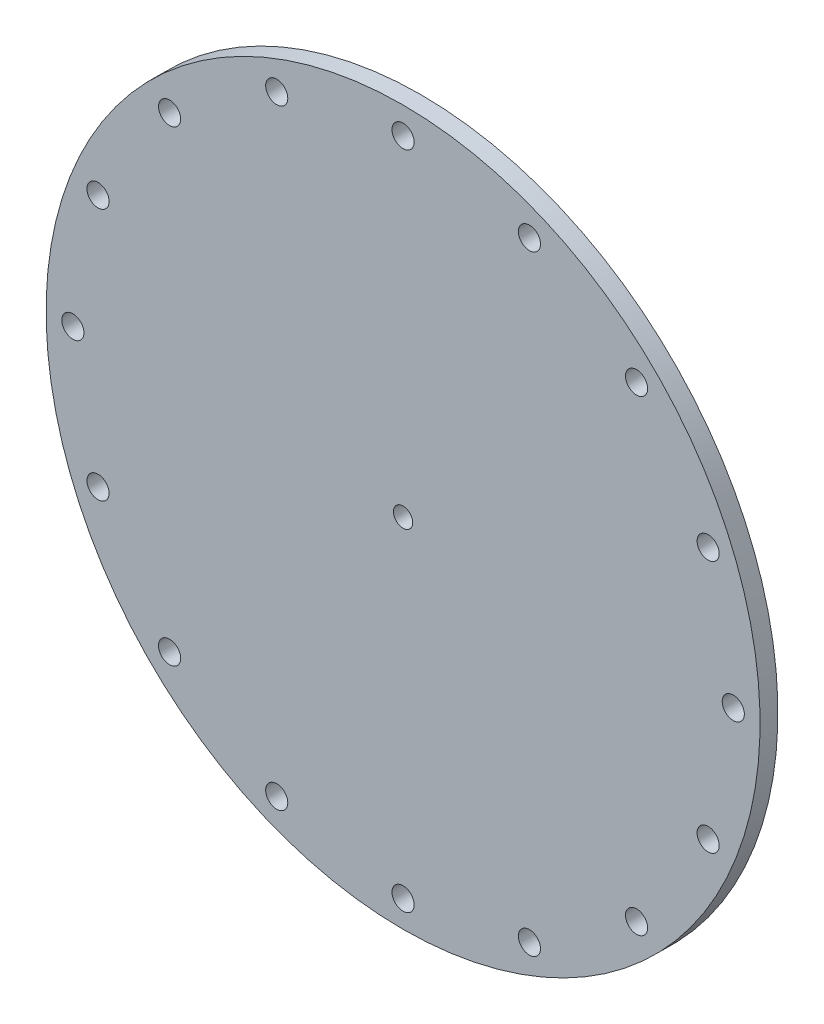
ISO-10303-21;
HEADER;
FILE_DESCRIPTION(('STEP AP214'),'2;1');
FILE_NAME('part.step','',(''),(''),'','','');
FILE_SCHEMA(('AUTOMOTIVE_DESIGN { 1 0 10303 214 1 1 1 1 }'));
ENDSEC;
DATA;
#1=APPLICATION_CONTEXT('core data for automotive mechanical design processes');
#2=APPLICATION_PROTOCOL_DEFINITION('international standard','automotive_design',2000,#1);
#3=PRODUCT_CONTEXT('',#1,'mechanical');
#4=PRODUCT('Part','Part','',(#3));
#5=PRODUCT_RELATED_PRODUCT_CATEGORY('part','',(#4));
#6=PRODUCT_DEFINITION_FORMATION('','',#4);
#7=PRODUCT_DEFINITION_CONTEXT('part definition',#1,'design');
#8=PRODUCT_DEFINITION('design','',#6,#7);
#9=PRODUCT_DEFINITION_SHAPE('','',#8);
#10=(LENGTH_UNIT() NAMED_UNIT(*) SI_UNIT(.MILLI.,.METRE.));
#11=(NAMED_UNIT(*) PLANE_ANGLE_UNIT() SI_UNIT($,.RADIAN.));
#12=(NAMED_UNIT(*) SI_UNIT($,.STERADIAN.) SOLID_ANGLE_UNIT());
#13=UNCERTAINTY_MEASURE_WITH_UNIT(LENGTH_MEASURE(1.E-05),#10,'distance_accuracy_value','');
#14=(GEOMETRIC_REPRESENTATION_CONTEXT(3) GLOBAL_UNCERTAINTY_ASSIGNED_CONTEXT((#13)) GLOBAL_UNIT_ASSIGNED_CONTEXT((#10,
#11,#12)) REPRESENTATION_CONTEXT('',''));
#15=CARTESIAN_POINT('',(0.,0.,0.));
#16=DIRECTION('',(0.,0.,1.));
#17=DIRECTION('',(1.,0.,0.));
#18=AXIS2_PLACEMENT_3D('',#15,#16,#17);
#19=CARTESIAN_POINT('',(-44.955736217089,108.532748081763,-359.266367059317));
#20=DIRECTION('',(0.,0.,1.));
#21=DIRECTION('',(1.,0.,0.));
#22=AXIS2_PLACEMENT_3D('',#19,#20,#21);
#23=CYLINDRICAL_SURFACE('',#22,3.937);
#24=CARTESIAN_POINT('',(-44.955736217089,108.532748081763,-6.34999999999998));
#25=DIRECTION('',(0.,0.,1.));
#26=DIRECTION('',(1.,0.,0.));
#27=AXIS2_PLACEMENT_3D('',#24,#25,#26);
#28=CIRCLE('',#27,3.937);
#29=CARTESIAN_POINT('',(-41.018736217089,108.532748081763,-6.34999999999998));
#30=VERTEX_POINT('',#29);
#31=EDGE_CURVE('E25',#30,#30,#28,.T.);
#32=ORIENTED_EDGE('',*,*,#31,.F.);
#33=EDGE_LOOP('',(#32));
#34=FACE_BOUND('',#33,.T.);
#35=CARTESIAN_POINT('',(-44.955736217089,108.532748081763,0.));
#36=DIRECTION('',(0.,0.,-1.));
#37=DIRECTION('',(0.,-1.,0.));
#38=AXIS2_PLACEMENT_3D('',#35,#36,#37);
#39=CIRCLE('',#38,3.937);
#40=CARTESIAN_POINT('',(-44.955736217089,104.595748081763,0.));
#41=VERTEX_POINT('',#40);
#42=EDGE_CURVE('E40',#41,#41,#39,.T.);
#43=ORIENTED_EDGE('',*,*,#42,.F.);
#44=EDGE_LOOP('',(#43));
#45=FACE_BOUND('',#44,.T.);
#46=ADVANCED_FACE('F14',(#34,#45),#23,.F.);
#47=CARTESIAN_POINT('',(-83.0673691198898,83.0673691198896,-359.266367059317));
#48=DIRECTION('',(0.,0.,1.));
#49=DIRECTION('',(1.,0.,0.));
#50=AXIS2_PLACEMENT_3D('',#47,#48,#49);
#51=CYLINDRICAL_SURFACE('',#50,3.937);
#52=CARTESIAN_POINT('',(-83.0673691198898,83.0673691198896,-6.34999999999998));
#53=DIRECTION('',(0.,0.,1.));
#54=DIRECTION('',(1.,0.,0.));
#55=AXIS2_PLACEMENT_3D('',#52,#53,#54);
#56=CIRCLE('',#55,3.937);
#57=CARTESIAN_POINT('',(-79.1303691198898,83.0673691198896,-6.34999999999998));
#58=VERTEX_POINT('',#57);
#59=EDGE_CURVE('E29',#58,#58,#56,.T.);
#60=ORIENTED_EDGE('',*,*,#59,.F.);
#61=EDGE_LOOP('',(#60));
#62=FACE_BOUND('',#61,.T.);
#63=CARTESIAN_POINT('',(-83.0673691198898,83.0673691198896,0.));
#64=DIRECTION('',(0.,0.,-1.));
#65=DIRECTION('',(0.,-1.,0.));
#66=AXIS2_PLACEMENT_3D('',#63,#64,#65);
#67=CIRCLE('',#66,3.937);
#68=CARTESIAN_POINT('',(-83.0673691198898,79.1303691198896,0.));
#69=VERTEX_POINT('',#68);
#70=EDGE_CURVE('E121',#69,#69,#67,.T.);
#71=ORIENTED_EDGE('',*,*,#70,.F.);
#72=EDGE_LOOP('',(#71));
#73=FACE_BOUND('',#72,.T.);
#74=ADVANCED_FACE('F135',(#62,#73),#51,.F.);
#75=CARTESIAN_POINT('',(-108.532748081763,44.9557362170889,-359.266367059317));
#76=DIRECTION('',(0.,0.,1.));
#77=DIRECTION('',(1.,0.,0.));
#78=AXIS2_PLACEMENT_3D('',#75,#76,#77);
#79=CYLINDRICAL_SURFACE('',#78,3.937);
#80=CARTESIAN_POINT('',(-108.532748081763,44.9557362170889,-6.34999999999998));
#81=DIRECTION('',(0.,0.,1.));
#82=DIRECTION('',(1.,0.,0.));
#83=AXIS2_PLACEMENT_3D('',#80,#81,#82);
#84=CIRCLE('',#83,3.937);
#85=CARTESIAN_POINT('',(-104.595748081763,44.9557362170889,-6.34999999999998));
#86=VERTEX_POINT('',#85);
#87=EDGE_CURVE('E118',#86,#86,#84,.T.);
#88=ORIENTED_EDGE('',*,*,#87,.F.);
#89=EDGE_LOOP('',(#88));
#90=FACE_BOUND('',#89,.T.);
#91=CARTESIAN_POINT('',(-108.532748081763,44.9557362170889,0.));
#92=DIRECTION('',(0.,0.,-1.));
#93=DIRECTION('',(0.,-1.,0.));
#94=AXIS2_PLACEMENT_3D('',#91,#92,#93);
#95=CIRCLE('',#94,3.937);
#96=CARTESIAN_POINT('',(-108.532748081763,41.0187362170889,0.));
#97=VERTEX_POINT('',#96);
#98=EDGE_CURVE('E115',#97,#97,#95,.T.);
#99=ORIENTED_EDGE('',*,*,#98,.F.);
#100=EDGE_LOOP('',(#99));
#101=FACE_BOUND('',#100,.T.);
#102=ADVANCED_FACE('F142',(#90,#101),#79,.F.);
#103=CARTESIAN_POINT('',(-117.475,-1.332267592E-13,-359.266367059317));
#104=DIRECTION('',(0.,0.,1.));
#105=DIRECTION('',(1.,0.,0.));
#106=AXIS2_PLACEMENT_3D('',#103,#104,#105);
#107=CYLINDRICAL_SURFACE('',#106,3.937);
#108=CARTESIAN_POINT('',(-117.475,-1.332267592E-13,-6.34999999999998));
#109=DIRECTION('',(0.,0.,1.));
#110=DIRECTION('',(1.,0.,0.));
#111=AXIS2_PLACEMENT_3D('',#108,#109,#110);
#112=CIRCLE('',#111,3.937);
#113=CARTESIAN_POINT('',(-113.538,-1.332267592E-13,-6.34999999999998));
#114=VERTEX_POINT('',#113);
#115=EDGE_CURVE('E112',#114,#114,#112,.T.);
#116=ORIENTED_EDGE('',*,*,#115,.F.);
#117=EDGE_LOOP('',(#116));
#118=FACE_BOUND('',#117,.T.);
#119=CARTESIAN_POINT('',(-117.475,-1.332267592E-13,0.));
#120=DIRECTION('',(0.,0.,-1.));
#121=DIRECTION('',(0.,-1.,0.));
#122=AXIS2_PLACEMENT_3D('',#119,#120,#121);
#123=CIRCLE('',#122,3.937);
#124=CARTESIAN_POINT('',(-117.475,-3.93700000000013,0.));
#125=VERTEX_POINT('',#124);
#126=EDGE_CURVE('E109',#125,#125,#123,.T.);
#127=ORIENTED_EDGE('',*,*,#126,.F.);
#128=EDGE_LOOP('',(#127));
#129=FACE_BOUND('',#128,.T.);
#130=ADVANCED_FACE('F150',(#118,#129),#107,.F.);
#131=CARTESIAN_POINT('',(-108.532748081763,-44.955736217089,-359.266367059317));
#132=DIRECTION('',(0.,0.,1.));
#133=DIRECTION('',(1.,0.,0.));
#134=AXIS2_PLACEMENT_3D('',#131,#132,#133);
#135=CYLINDRICAL_SURFACE('',#134,3.937);
#136=CARTESIAN_POINT('',(-108.532748081763,-44.955736217089,-6.34999999999998));
#137=DIRECTION('',(0.,0.,1.));
#138=DIRECTION('',(1.,0.,0.));
#139=AXIS2_PLACEMENT_3D('',#136,#137,#138);
#140=CIRCLE('',#139,3.937);
#141=CARTESIAN_POINT('',(-104.595748081763,-44.955736217089,-6.34999999999998));
#142=VERTEX_POINT('',#141);
#143=EDGE_CURVE('E106',#142,#142,#140,.T.);
#144=ORIENTED_EDGE('',*,*,#143,.F.);
#145=EDGE_LOOP('',(#144));
#146=FACE_BOUND('',#145,.T.);
#147=CARTESIAN_POINT('',(-108.532748081763,-44.955736217089,0.));
#148=DIRECTION('',(0.,0.,-1.));
#149=DIRECTION('',(0.,-1.,0.));
#150=AXIS2_PLACEMENT_3D('',#147,#148,#149);
#151=CIRCLE('',#150,3.937);
#152=CARTESIAN_POINT('',(-108.532748081763,-48.892736217089,0.));
#153=VERTEX_POINT('',#152);
#154=EDGE_CURVE('E103',#153,#153,#151,.T.);
#155=ORIENTED_EDGE('',*,*,#154,.F.);
#156=EDGE_LOOP('',(#155));
#157=FACE_BOUND('',#156,.T.);
#158=ADVANCED_FACE('F154',(#146,#157),#135,.F.);
#159=CARTESIAN_POINT('',(-83.0673691198896,-83.0673691198897,-359.266367059317));
#160=DIRECTION('',(0.,0.,1.));
#161=DIRECTION('',(1.,0.,0.));
#162=AXIS2_PLACEMENT_3D('',#159,#160,#161);
#163=CYLINDRICAL_SURFACE('',#162,3.937);
#164=CARTESIAN_POINT('',(-83.0673691198896,-83.0673691198897,-6.34999999999998));
#165=DIRECTION('',(0.,0.,1.));
#166=DIRECTION('',(1.,0.,0.));
#167=AXIS2_PLACEMENT_3D('',#164,#165,#166);
#168=CIRCLE('',#167,3.937);
#169=CARTESIAN_POINT('',(-79.1303691198896,-83.0673691198897,-6.34999999999998));
#170=VERTEX_POINT('',#169);
#171=EDGE_CURVE('E100',#170,#170,#168,.T.);
#172=ORIENTED_EDGE('',*,*,#171,.F.);
#173=EDGE_LOOP('',(#172));
#174=FACE_BOUND('',#173,.T.);
#175=CARTESIAN_POINT('',(-83.0673691198896,-83.0673691198897,0.));
#176=DIRECTION('',(0.,0.,-1.));
#177=DIRECTION('',(0.,-1.,0.));
#178=AXIS2_PLACEMENT_3D('',#175,#176,#177);
#179=CIRCLE('',#178,3.937);
#180=CARTESIAN_POINT('',(-83.0673691198896,-87.0043691198897,0.));
#181=VERTEX_POINT('',#180);
#182=EDGE_CURVE('E97',#181,#181,#179,.T.);
#183=ORIENTED_EDGE('',*,*,#182,.F.);
#184=EDGE_LOOP('',(#183));
#185=FACE_BOUND('',#184,.T.);
#186=ADVANCED_FACE('F158',(#174,#185),#163,.F.);
#187=CARTESIAN_POINT('',(-44.9557362170889,-108.532748081763,-359.266367059317));
#188=DIRECTION('',(0.,0.,1.));
#189=DIRECTION('',(1.,0.,0.));
#190=AXIS2_PLACEMENT_3D('',#187,#188,#189);
#191=CYLINDRICAL_SURFACE('',#190,3.937);
#192=CARTESIAN_POINT('',(-44.9557362170889,-108.532748081763,-6.34999999999998));
#193=DIRECTION('',(0.,0.,1.));
#194=DIRECTION('',(1.,0.,0.));
#195=AXIS2_PLACEMENT_3D('',#192,#193,#194);
#196=CIRCLE('',#195,3.937);
#197=CARTESIAN_POINT('',(-41.0187362170889,-108.532748081763,-6.34999999999998));
#198=VERTEX_POINT('',#197);
#199=EDGE_CURVE('E94',#198,#198,#196,.T.);
#200=ORIENTED_EDGE('',*,*,#199,.F.);
#201=EDGE_LOOP('',(#200));
#202=FACE_BOUND('',#201,.T.);
#203=CARTESIAN_POINT('',(-44.9557362170889,-108.532748081763,0.));
#204=DIRECTION('',(0.,0.,-1.));
#205=DIRECTION('',(0.,-1.,0.));
#206=AXIS2_PLACEMENT_3D('',#203,#204,#205);
#207=CIRCLE('',#206,3.937);
#208=CARTESIAN_POINT('',(-44.9557362170889,-112.469748081763,0.));
#209=VERTEX_POINT('',#208);
#210=EDGE_CURVE('E91',#209,#209,#207,.T.);
#211=ORIENTED_EDGE('',*,*,#210,.F.);
#212=EDGE_LOOP('',(#211));
#213=FACE_BOUND('',#212,.T.);
#214=ADVANCED_FACE('F162',(#202,#213),#191,.F.);
#215=CARTESIAN_POINT('',(0.,-117.475,-359.266367059317));
#216=DIRECTION('',(0.,0.,1.));
#217=DIRECTION('',(1.,0.,0.));
#218=AXIS2_PLACEMENT_3D('',#215,#216,#217);
#219=CYLINDRICAL_SURFACE('',#218,3.937);
#220=CARTESIAN_POINT('',(0.,-117.475,-6.34999999999998));
#221=DIRECTION('',(0.,0.,1.));
#222=DIRECTION('',(1.,0.,0.));
#223=AXIS2_PLACEMENT_3D('',#220,#221,#222);
#224=CIRCLE('',#223,3.937);
#225=CARTESIAN_POINT('',(3.93700000000006,-117.475,-6.34999999999998));
#226=VERTEX_POINT('',#225);
#227=EDGE_CURVE('E88',#226,#226,#224,.T.);
#228=ORIENTED_EDGE('',*,*,#227,.F.);
#229=EDGE_LOOP('',(#228));
#230=FACE_BOUND('',#229,.T.);
#231=CARTESIAN_POINT('',(0.,-117.475,0.));
#232=DIRECTION('',(0.,0.,-1.));
#233=DIRECTION('',(0.,-1.,0.));
#234=AXIS2_PLACEMENT_3D('',#231,#232,#233);
#235=CIRCLE('',#234,3.937);
#236=CARTESIAN_POINT('',(0.,-121.412,0.));
#237=VERTEX_POINT('',#236);
#238=EDGE_CURVE('E85',#237,#237,#235,.T.);
#239=ORIENTED_EDGE('',*,*,#238,.F.);
#240=EDGE_LOOP('',(#239));
#241=FACE_BOUND('',#240,.T.);
#242=ADVANCED_FACE('F166',(#230,#241),#219,.F.);
#243=CARTESIAN_POINT('',(44.955736217089,-108.532748081763,-359.266367059317));
#244=DIRECTION('',(0.,0.,1.));
#245=DIRECTION('',(1.,0.,0.));
#246=AXIS2_PLACEMENT_3D('',#243,#244,#245);
#247=CYLINDRICAL_SURFACE('',#246,3.937);
#248=CARTESIAN_POINT('',(44.955736217089,-108.532748081763,-6.34999999999998));
#249=DIRECTION('',(0.,0.,1.));
#250=DIRECTION('',(1.,0.,0.));
#251=AXIS2_PLACEMENT_3D('',#248,#249,#250);
#252=CIRCLE('',#251,3.937);
#253=CARTESIAN_POINT('',(48.892736217089,-108.532748081763,-6.34999999999998));
#254=VERTEX_POINT('',#253);
#255=EDGE_CURVE('E82',#254,#254,#252,.T.);
#256=ORIENTED_EDGE('',*,*,#255,.F.);
#257=EDGE_LOOP('',(#256));
#258=FACE_BOUND('',#257,.T.);
#259=CARTESIAN_POINT('',(44.955736217089,-108.532748081763,0.));
#260=DIRECTION('',(0.,0.,-1.));
#261=DIRECTION('',(0.,-1.,0.));
#262=AXIS2_PLACEMENT_3D('',#259,#260,#261);
#263=CIRCLE('',#262,3.937);
#264=CARTESIAN_POINT('',(44.955736217089,-112.469748081763,0.));
#265=VERTEX_POINT('',#264);
#266=EDGE_CURVE('E79',#265,#265,#263,.T.);
#267=ORIENTED_EDGE('',*,*,#266,.F.);
#268=EDGE_LOOP('',(#267));
#269=FACE_BOUND('',#268,.T.);
#270=ADVANCED_FACE('F170',(#258,#269),#247,.F.);
#271=CARTESIAN_POINT('',(83.0673691198897,-83.0673691198896,-359.266367059317));
#272=DIRECTION('',(0.,0.,1.));
#273=DIRECTION('',(1.,0.,0.));
#274=AXIS2_PLACEMENT_3D('',#271,#272,#273);
#275=CYLINDRICAL_SURFACE('',#274,3.937);
#276=CARTESIAN_POINT('',(83.0673691198897,-83.0673691198896,-6.34999999999998));
#277=DIRECTION('',(0.,0.,1.));
#278=DIRECTION('',(1.,0.,0.));
#279=AXIS2_PLACEMENT_3D('',#276,#277,#278);
#280=CIRCLE('',#279,3.937);
#281=CARTESIAN_POINT('',(87.0043691198897,-83.0673691198896,-6.34999999999998));
#282=VERTEX_POINT('',#281);
#283=EDGE_CURVE('E76',#282,#282,#280,.T.);
#284=ORIENTED_EDGE('',*,*,#283,.F.);
#285=EDGE_LOOP('',(#284));
#286=FACE_BOUND('',#285,.T.);
#287=CARTESIAN_POINT('',(83.0673691198897,-83.0673691198896,0.));
#288=DIRECTION('',(0.,0.,-1.));
#289=DIRECTION('',(0.,-1.,0.));
#290=AXIS2_PLACEMENT_3D('',#287,#288,#289);
#291=CIRCLE('',#290,3.937);
#292=CARTESIAN_POINT('',(83.0673691198897,-87.0043691198896,0.));
#293=VERTEX_POINT('',#292);
#294=EDGE_CURVE('E73',#293,#293,#291,.T.);
#295=ORIENTED_EDGE('',*,*,#294,.F.);
#296=EDGE_LOOP('',(#295));
#297=FACE_BOUND('',#296,.T.);
#298=ADVANCED_FACE('F174',(#286,#297),#275,.F.);
#299=CARTESIAN_POINT('',(108.532748081763,-44.9557362170889,-359.266367059317));
#300=DIRECTION('',(0.,0.,1.));
#301=DIRECTION('',(1.,0.,0.));
#302=AXIS2_PLACEMENT_3D('',#299,#300,#301);
#303=CYLINDRICAL_SURFACE('',#302,3.937);
#304=CARTESIAN_POINT('',(108.532748081763,-44.9557362170889,-6.34999999999998));
#305=DIRECTION('',(0.,0.,1.));
#306=DIRECTION('',(1.,0.,0.));
#307=AXIS2_PLACEMENT_3D('',#304,#305,#306);
#308=CIRCLE('',#307,3.937);
#309=CARTESIAN_POINT('',(112.469748081763,-44.9557362170889,-6.34999999999998));
#310=VERTEX_POINT('',#309);
#311=EDGE_CURVE('E70',#310,#310,#308,.T.);
#312=ORIENTED_EDGE('',*,*,#311,.F.);
#313=EDGE_LOOP('',(#312));
#314=FACE_BOUND('',#313,.T.);
#315=CARTESIAN_POINT('',(108.532748081763,-44.9557362170889,0.));
#316=DIRECTION('',(0.,0.,-1.));
#317=DIRECTION('',(0.,-1.,0.));
#318=AXIS2_PLACEMENT_3D('',#315,#316,#317);
#319=CIRCLE('',#318,3.937);
#320=CARTESIAN_POINT('',(108.532748081763,-48.8927362170889,0.));
#321=VERTEX_POINT('',#320);
#322=EDGE_CURVE('E67',#321,#321,#319,.T.);
#323=ORIENTED_EDGE('',*,*,#322,.F.);
#324=EDGE_LOOP('',(#323));
#325=FACE_BOUND('',#324,.T.);
#326=ADVANCED_FACE('F178',(#314,#325),#303,.F.);
#327=CARTESIAN_POINT('',(117.475,0.,-359.266367059317));
#328=DIRECTION('',(0.,0.,1.));
#329=DIRECTION('',(1.,0.,0.));
#330=AXIS2_PLACEMENT_3D('',#327,#328,#329);
#331=CYLINDRICAL_SURFACE('',#330,3.937);
#332=CARTESIAN_POINT('',(117.475,0.,-6.34999999999998));
#333=DIRECTION('',(0.,0.,1.));
#334=DIRECTION('',(1.,0.,0.));
#335=AXIS2_PLACEMENT_3D('',#332,#333,#334);
#336=CIRCLE('',#335,3.937);
#337=CARTESIAN_POINT('',(121.412,0.,-6.34999999999998));
#338=VERTEX_POINT('',#337);
#339=EDGE_CURVE('E64',#338,#338,#336,.T.);
#340=ORIENTED_EDGE('',*,*,#339,.F.);
#341=EDGE_LOOP('',(#340));
#342=FACE_BOUND('',#341,.T.);
#343=CARTESIAN_POINT('',(117.475,0.,0.));
#344=DIRECTION('',(0.,0.,-1.));
#345=DIRECTION('',(0.,-1.,0.));
#346=AXIS2_PLACEMENT_3D('',#343,#344,#345);
#347=CIRCLE('',#346,3.937);
#348=CARTESIAN_POINT('',(117.475,-3.93699999999996,0.));
#349=VERTEX_POINT('',#348);
#350=EDGE_CURVE('E61',#349,#349,#347,.T.);
#351=ORIENTED_EDGE('',*,*,#350,.F.);
#352=EDGE_LOOP('',(#351));
#353=FACE_BOUND('',#352,.T.);
#354=ADVANCED_FACE('F182',(#342,#353),#331,.F.);
#355=CARTESIAN_POINT('',(108.532748081763,44.9557362170889,-359.266367059317));
#356=DIRECTION('',(0.,0.,1.));
#357=DIRECTION('',(1.,0.,0.));
#358=AXIS2_PLACEMENT_3D('',#355,#356,#357);
#359=CYLINDRICAL_SURFACE('',#358,3.937);
#360=CARTESIAN_POINT('',(108.532748081763,44.9557362170889,-6.34999999999998));
#361=DIRECTION('',(0.,0.,1.));
#362=DIRECTION('',(1.,0.,0.));
#363=AXIS2_PLACEMENT_3D('',#360,#361,#362);
#364=CIRCLE('',#363,3.937);
#365=CARTESIAN_POINT('',(112.469748081763,44.9557362170889,-6.34999999999998));
#366=VERTEX_POINT('',#365);
#367=EDGE_CURVE('E58',#366,#366,#364,.T.);
#368=ORIENTED_EDGE('',*,*,#367,.F.);
#369=EDGE_LOOP('',(#368));
#370=FACE_BOUND('',#369,.T.);
#371=CARTESIAN_POINT('',(108.532748081763,44.9557362170889,0.));
#372=DIRECTION('',(0.,0.,-1.));
#373=DIRECTION('',(0.,-1.,0.));
#374=AXIS2_PLACEMENT_3D('',#371,#372,#373);
#375=CIRCLE('',#374,3.937);
#376=CARTESIAN_POINT('',(108.532748081763,41.0187362170889,0.));
#377=VERTEX_POINT('',#376);
#378=EDGE_CURVE('E55',#377,#377,#375,.T.);
#379=ORIENTED_EDGE('',*,*,#378,.F.);
#380=EDGE_LOOP('',(#379));
#381=FACE_BOUND('',#380,.T.);
#382=ADVANCED_FACE('F186',(#370,#381),#359,.F.);
#383=CARTESIAN_POINT('',(83.0673691198897,83.0673691198897,-359.266367059317));
#384=DIRECTION('',(0.,0.,1.));
#385=DIRECTION('',(1.,0.,0.));
#386=AXIS2_PLACEMENT_3D('',#383,#384,#385);
#387=CYLINDRICAL_SURFACE('',#386,3.937);
#388=CARTESIAN_POINT('',(83.0673691198897,83.0673691198897,-6.34999999999998));
#389=DIRECTION('',(0.,0.,1.));
#390=DIRECTION('',(1.,0.,0.));
#391=AXIS2_PLACEMENT_3D('',#388,#389,#390);
#392=CIRCLE('',#391,3.937);
#393=CARTESIAN_POINT('',(87.0043691198897,83.0673691198897,-6.34999999999998));
#394=VERTEX_POINT('',#393);
#395=EDGE_CURVE('E52',#394,#394,#392,.T.);
#396=ORIENTED_EDGE('',*,*,#395,.F.);
#397=EDGE_LOOP('',(#396));
#398=FACE_BOUND('',#397,.T.);
#399=CARTESIAN_POINT('',(83.0673691198897,83.0673691198897,0.));
#400=DIRECTION('',(0.,0.,-1.));
#401=DIRECTION('',(0.,-1.,0.));
#402=AXIS2_PLACEMENT_3D('',#399,#400,#401);
#403=CIRCLE('',#402,3.937);
#404=CARTESIAN_POINT('',(83.0673691198897,79.1303691198897,0.));
#405=VERTEX_POINT('',#404);
#406=EDGE_CURVE('E49',#405,#405,#403,.T.);
#407=ORIENTED_EDGE('',*,*,#406,.F.);
#408=EDGE_LOOP('',(#407));
#409=FACE_BOUND('',#408,.T.);
#410=ADVANCED_FACE('F190',(#398,#409),#387,.F.);
#411=CARTESIAN_POINT('',(44.9557362170889,108.532748081763,-359.266367059317));
#412=DIRECTION('',(0.,0.,1.));
#413=DIRECTION('',(1.,0.,0.));
#414=AXIS2_PLACEMENT_3D('',#411,#412,#413);
#415=CYLINDRICAL_SURFACE('',#414,3.937);
#416=CARTESIAN_POINT('',(44.9557362170889,108.532748081763,-6.34999999999998));
#417=DIRECTION('',(0.,0.,1.));
#418=DIRECTION('',(1.,0.,0.));
#419=AXIS2_PLACEMENT_3D('',#416,#417,#418);
#420=CIRCLE('',#419,3.937);
#421=CARTESIAN_POINT('',(48.8927362170889,108.532748081763,-6.34999999999998));
#422=VERTEX_POINT('',#421);
#423=EDGE_CURVE('E46',#422,#422,#420,.T.);
#424=ORIENTED_EDGE('',*,*,#423,.F.);
#425=EDGE_LOOP('',(#424));
#426=FACE_BOUND('',#425,.T.);
#427=CARTESIAN_POINT('',(44.9557362170889,108.532748081763,0.));
#428=DIRECTION('',(0.,0.,-1.));
#429=DIRECTION('',(0.,-1.,0.));
#430=AXIS2_PLACEMENT_3D('',#427,#428,#429);
#431=CIRCLE('',#430,3.937);
#432=CARTESIAN_POINT('',(44.9557362170889,104.595748081763,0.));
#433=VERTEX_POINT('',#432);
#434=EDGE_CURVE('E43',#433,#433,#431,.T.);
#435=ORIENTED_EDGE('',*,*,#434,.F.);
#436=EDGE_LOOP('',(#435));
#437=FACE_BOUND('',#436,.T.);
#438=ADVANCED_FACE('F194',(#426,#437),#415,.F.);
#439=CARTESIAN_POINT('',(0.,117.475,-359.266367059317));
#440=DIRECTION('',(0.,0.,1.));
#441=DIRECTION('',(1.,0.,0.));
#442=AXIS2_PLACEMENT_3D('',#439,#440,#441);
#443=CYLINDRICAL_SURFACE('',#442,3.937);
#444=CARTESIAN_POINT('',(0.,117.475,-6.34999999999998));
#445=DIRECTION('',(0.,0.,1.));
#446=DIRECTION('',(1.,0.,0.));
#447=AXIS2_PLACEMENT_3D('',#444,#445,#446);
#448=CIRCLE('',#447,3.937);
#449=CARTESIAN_POINT('',(3.937,117.475,-6.34999999999998));
#450=VERTEX_POINT('',#449);
#451=EDGE_CURVE('E39',#450,#450,#448,.T.);
#452=ORIENTED_EDGE('',*,*,#451,.F.);
#453=EDGE_LOOP('',(#452));
#454=FACE_BOUND('',#453,.T.);
#455=CARTESIAN_POINT('',(0.,117.475,0.));
#456=DIRECTION('',(0.,0.,-1.));
#457=DIRECTION('',(0.,-1.,0.));
#458=AXIS2_PLACEMENT_3D('',#455,#456,#457);
#459=CIRCLE('',#458,3.937);
#460=CARTESIAN_POINT('',(0.,113.538,0.));
#461=VERTEX_POINT('',#460);
#462=EDGE_CURVE('E35',#461,#461,#459,.T.);
#463=ORIENTED_EDGE('',*,*,#462,.F.);
#464=EDGE_LOOP('',(#463));
#465=FACE_BOUND('',#464,.T.);
#466=ADVANCED_FACE('F198',(#454,#465),#443,.F.);
#467=CARTESIAN_POINT('',(0.,0.,-359.266367059317));
#468=DIRECTION('',(0.,0.,1.));
#469=DIRECTION('',(1.,0.,0.));
#470=AXIS2_PLACEMENT_3D('',#467,#468,#469);
#471=CYLINDRICAL_SURFACE('',#470,3.429);
#472=CARTESIAN_POINT('',(0.,0.,-6.34999999999998));
#473=DIRECTION('',(0.,0.,1.));
#474=DIRECTION('',(1.,0.,0.));
#475=AXIS2_PLACEMENT_3D('',#472,#473,#474);
#476=CIRCLE('',#475,3.429);
#477=CARTESIAN_POINT('',(3.429,0.,-6.34999999999998));
#478=VERTEX_POINT('',#477);
#479=EDGE_CURVE('E36',#478,#478,#476,.T.);
#480=ORIENTED_EDGE('',*,*,#479,.F.);
#481=EDGE_LOOP('',(#480));
#482=FACE_BOUND('',#481,.T.);
#483=CARTESIAN_POINT('',(0.,0.,0.));
#484=DIRECTION('',(0.,0.,-1.));
#485=DIRECTION('',(0.,-1.,0.));
#486=AXIS2_PLACEMENT_3D('',#483,#484,#485);
#487=CIRCLE('',#486,3.429);
#488=CARTESIAN_POINT('',(0.,-3.429,0.));
#489=VERTEX_POINT('',#488);
#490=EDGE_CURVE('E32',#489,#489,#487,.T.);
#491=ORIENTED_EDGE('',*,*,#490,.F.);
#492=EDGE_LOOP('',(#491));
#493=FACE_BOUND('',#492,.T.);
#494=ADVANCED_FACE('F201',(#482,#493),#471,.F.);
#495=CARTESIAN_POINT('',(0.,0.,0.));
#496=DIRECTION('',(0.,0.,-1.));
#497=DIRECTION('',(0.,-1.,0.));
#498=AXIS2_PLACEMENT_3D('',#495,#496,#497);
#499=CYLINDRICAL_SURFACE('',#498,127.);
#500=CARTESIAN_POINT('',(0.,0.,-6.35));
#501=DIRECTION('',(0.,0.,-1.));
#502=DIRECTION('',(0.,-1.,0.));
#503=AXIS2_PLACEMENT_3D('',#500,#501,#502);
#504=CIRCLE('',#503,127.);
#505=CARTESIAN_POINT('',(0.,-127.,-6.35));
#506=VERTEX_POINT('',#505);
#507=EDGE_CURVE('E21',#506,#506,#504,.T.);
#508=ORIENTED_EDGE('',*,*,#507,.F.);
#509=EDGE_LOOP('',(#508));
#510=FACE_BOUND('',#509,.T.);
#511=CARTESIAN_POINT('',(0.,0.,0.));
#512=DIRECTION('',(0.,0.,-1.));
#513=DIRECTION('',(0.,-1.,0.));
#514=AXIS2_PLACEMENT_3D('',#511,#512,#513);
#515=CIRCLE('',#514,127.);
#516=CARTESIAN_POINT('',(0.,-127.,0.));
#517=VERTEX_POINT('',#516);
#518=EDGE_CURVE('E9',#517,#517,#515,.T.);
#519=ORIENTED_EDGE('',*,*,#518,.T.);
#520=EDGE_LOOP('',(#519));
#521=FACE_BOUND('',#520,.T.);
#522=ADVANCED_FACE('F16',(#510,#521),#499,.T.);
#523=CARTESIAN_POINT('',(0.,0.,-6.35));
#524=DIRECTION('',(0.,0.,1.));
#525=DIRECTION('',(1.,0.,0.));
#526=AXIS2_PLACEMENT_3D('',#523,#524,#525);
#527=PLANE('',#526);
#528=ORIENTED_EDGE('',*,*,#507,.T.);
#529=EDGE_LOOP('',(#528));
#530=FACE_BOUND('',#529,.T.);
#531=ORIENTED_EDGE('',*,*,#31,.T.);
#532=EDGE_LOOP('',(#531));
#533=FACE_BOUND('',#532,.T.);
#534=ORIENTED_EDGE('',*,*,#59,.T.);
#535=EDGE_LOOP('',(#534));
#536=FACE_BOUND('',#535,.T.);
#537=ORIENTED_EDGE('',*,*,#87,.T.);
#538=EDGE_LOOP('',(#537));
#539=FACE_BOUND('',#538,.T.);
#540=ORIENTED_EDGE('',*,*,#115,.T.);
#541=EDGE_LOOP('',(#540));
#542=FACE_BOUND('',#541,.T.);
#543=ORIENTED_EDGE('',*,*,#143,.T.);
#544=EDGE_LOOP('',(#543));
#545=FACE_BOUND('',#544,.T.);
#546=ORIENTED_EDGE('',*,*,#171,.T.);
#547=EDGE_LOOP('',(#546));
#548=FACE_BOUND('',#547,.T.);
#549=ORIENTED_EDGE('',*,*,#199,.T.);
#550=EDGE_LOOP('',(#549));
#551=FACE_BOUND('',#550,.T.);
#552=ORIENTED_EDGE('',*,*,#227,.T.);
#553=EDGE_LOOP('',(#552));
#554=FACE_BOUND('',#553,.T.);
#555=ORIENTED_EDGE('',*,*,#255,.T.);
#556=EDGE_LOOP('',(#555));
#557=FACE_BOUND('',#556,.T.);
#558=ORIENTED_EDGE('',*,*,#283,.T.);
#559=EDGE_LOOP('',(#558));
#560=FACE_BOUND('',#559,.T.);
#561=ORIENTED_EDGE('',*,*,#311,.T.);
#562=EDGE_LOOP('',(#561));
#563=FACE_BOUND('',#562,.T.);
#564=ORIENTED_EDGE('',*,*,#339,.T.);
#565=EDGE_LOOP('',(#564));
#566=FACE_BOUND('',#565,.T.);
#567=ORIENTED_EDGE('',*,*,#367,.T.);
#568=EDGE_LOOP('',(#567));
#569=FACE_BOUND('',#568,.T.);
#570=ORIENTED_EDGE('',*,*,#395,.T.);
#571=EDGE_LOOP('',(#570));
#572=FACE_BOUND('',#571,.T.);
#573=ORIENTED_EDGE('',*,*,#423,.T.);
#574=EDGE_LOOP('',(#573));
#575=FACE_BOUND('',#574,.T.);
#576=ORIENTED_EDGE('',*,*,#451,.T.);
#577=EDGE_LOOP('',(#576));
#578=FACE_BOUND('',#577,.T.);
#579=ORIENTED_EDGE('',*,*,#479,.T.);
#580=EDGE_LOOP('',(#579));
#581=FACE_BOUND('',#580,.T.);
#582=ADVANCED_FACE('F208',(#530,#533,#536,#539,#542,#545,#548,#551,#554,#557,#560,#563,#566,
#569,#572,#575,#578,#581),#527,.F.);
#583=CARTESIAN_POINT('',(0.,0.,0.));
#584=DIRECTION('',(0.,0.,1.));
#585=DIRECTION('',(1.,0.,0.));
#586=AXIS2_PLACEMENT_3D('',#583,#584,#585);
#587=PLANE('',#586);
#588=ORIENTED_EDGE('',*,*,#518,.F.);
#589=EDGE_LOOP('',(#588));
#590=FACE_BOUND('',#589,.T.);
#591=ORIENTED_EDGE('',*,*,#42,.T.);
#592=EDGE_LOOP('',(#591));
#593=FACE_BOUND('',#592,.T.);
#594=ORIENTED_EDGE('',*,*,#70,.T.);
#595=EDGE_LOOP('',(#594));
#596=FACE_BOUND('',#595,.T.);
#597=ORIENTED_EDGE('',*,*,#98,.T.);
#598=EDGE_LOOP('',(#597));
#599=FACE_BOUND('',#598,.T.);
#600=ORIENTED_EDGE('',*,*,#126,.T.);
#601=EDGE_LOOP('',(#600));
#602=FACE_BOUND('',#601,.T.);
#603=ORIENTED_EDGE('',*,*,#154,.T.);
#604=EDGE_LOOP('',(#603));
#605=FACE_BOUND('',#604,.T.);
#606=ORIENTED_EDGE('',*,*,#182,.T.);
#607=EDGE_LOOP('',(#606));
#608=FACE_BOUND('',#607,.T.);
#609=ORIENTED_EDGE('',*,*,#210,.T.);
#610=EDGE_LOOP('',(#609));
#611=FACE_BOUND('',#610,.T.);
#612=ORIENTED_EDGE('',*,*,#238,.T.);
#613=EDGE_LOOP('',(#612));
#614=FACE_BOUND('',#613,.T.);
#615=ORIENTED_EDGE('',*,*,#266,.T.);
#616=EDGE_LOOP('',(#615));
#617=FACE_BOUND('',#616,.T.);
#618=ORIENTED_EDGE('',*,*,#294,.T.);
#619=EDGE_LOOP('',(#618));
#620=FACE_BOUND('',#619,.T.);
#621=ORIENTED_EDGE('',*,*,#322,.T.);
#622=EDGE_LOOP('',(#621));
#623=FACE_BOUND('',#622,.T.);
#624=ORIENTED_EDGE('',*,*,#350,.T.);
#625=EDGE_LOOP('',(#624));
#626=FACE_BOUND('',#625,.T.);
#627=ORIENTED_EDGE('',*,*,#378,.T.);
#628=EDGE_LOOP('',(#627));
#629=FACE_BOUND('',#628,.T.);
#630=ORIENTED_EDGE('',*,*,#406,.T.);
#631=EDGE_LOOP('',(#630));
#632=FACE_BOUND('',#631,.T.);
#633=ORIENTED_EDGE('',*,*,#434,.T.);
#634=EDGE_LOOP('',(#633));
#635=FACE_BOUND('',#634,.T.);
#636=ORIENTED_EDGE('',*,*,#462,.T.);
#637=EDGE_LOOP('',(#636));
#638=FACE_BOUND('',#637,.T.);
#639=ORIENTED_EDGE('',*,*,#490,.T.);
#640=EDGE_LOOP('',(#639));
#641=FACE_BOUND('',#640,.T.);
#642=ADVANCED_FACE('F131',(#590,#593,#596,#599,#602,#605,#608,#611,#614,#617,#620,#623,#626,
#629,#632,#635,#638,#641),#587,.T.);
#643=CLOSED_SHELL('',(#46,#74,#102,#130,#158,#186,#214,#242,#270,#298,#326,#354,#382,#410,#438,
#466,#494,#522,#582,#642));
#644=MANIFOLD_SOLID_BREP('B1',#643);
#645=ADVANCED_BREP_SHAPE_REPRESENTATION('',(#18,#644),#14);
#646=SHAPE_DEFINITION_REPRESENTATION(#9,#645);
ENDSEC;
END-ISO-10303-21;
